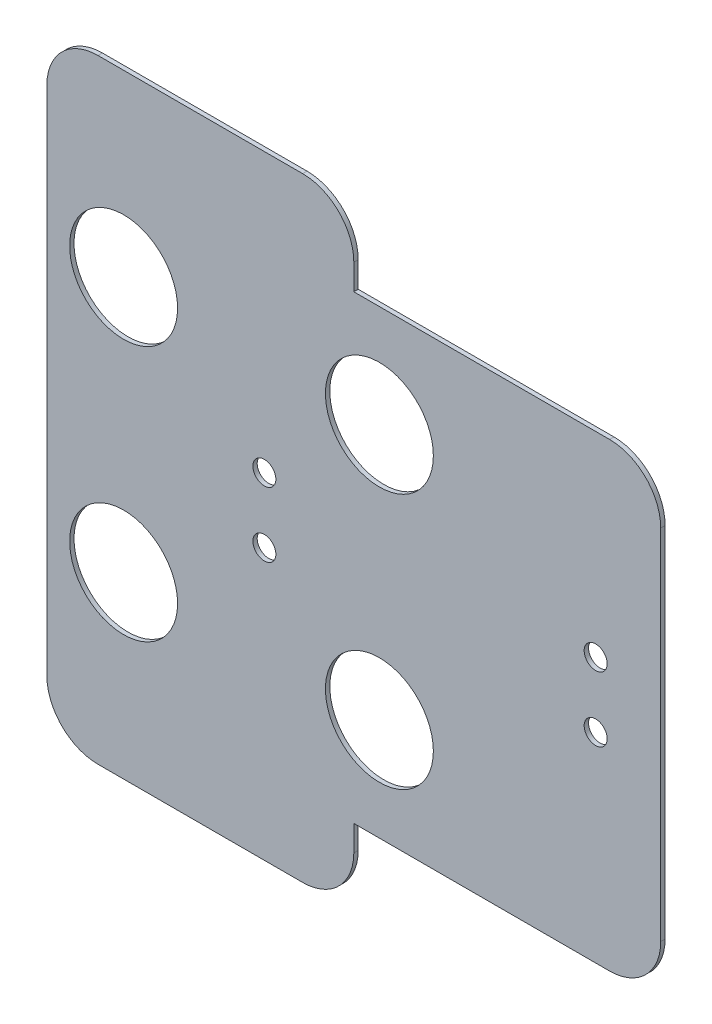
ISO-10303-21;
HEADER;
FILE_DESCRIPTION(('STEP AP214'),'2;1');
FILE_NAME('part.step','',(''),(''),'','','');
FILE_SCHEMA(('AUTOMOTIVE_DESIGN { 1 0 10303 214 1 1 1 1 }'));
ENDSEC;
DATA;
#1=APPLICATION_CONTEXT('core data for automotive mechanical design processes');
#2=APPLICATION_PROTOCOL_DEFINITION('international standard','automotive_design',2000,#1);
#3=PRODUCT_CONTEXT('',#1,'mechanical');
#4=PRODUCT('Part','Part','',(#3));
#5=PRODUCT_RELATED_PRODUCT_CATEGORY('part','',(#4));
#6=PRODUCT_DEFINITION_FORMATION('','',#4);
#7=PRODUCT_DEFINITION_CONTEXT('part definition',#1,'design');
#8=PRODUCT_DEFINITION('design','',#6,#7);
#9=PRODUCT_DEFINITION_SHAPE('','',#8);
#10=(LENGTH_UNIT() NAMED_UNIT(*) SI_UNIT(.MILLI.,.METRE.));
#11=(NAMED_UNIT(*) PLANE_ANGLE_UNIT() SI_UNIT($,.RADIAN.));
#12=(NAMED_UNIT(*) SI_UNIT($,.STERADIAN.) SOLID_ANGLE_UNIT());
#13=UNCERTAINTY_MEASURE_WITH_UNIT(LENGTH_MEASURE(1.E-05),#10,'distance_accuracy_value','');
#14=(GEOMETRIC_REPRESENTATION_CONTEXT(3) GLOBAL_UNCERTAINTY_ASSIGNED_CONTEXT((#13)) GLOBAL_UNIT_ASSIGNED_CONTEXT((#10,
#11,#12)) REPRESENTATION_CONTEXT('',''));
#15=CARTESIAN_POINT('',(0.,0.,0.));
#16=DIRECTION('',(0.,0.,1.));
#17=DIRECTION('',(1.,0.,0.));
#18=AXIS2_PLACEMENT_3D('',#15,#16,#17);
#19=CARTESIAN_POINT('',(83.471000671387,67.665000915527,-0.41148));
#20=DIRECTION('',(0.,0.,-1.));
#21=DIRECTION('',(0.,-1.,0.));
#22=AXIS2_PLACEMENT_3D('',#19,#20,#21);
#23=PLANE('',#22);
#24=CARTESIAN_POINT('',(104.927,79.019,-0.41148));
#25=DIRECTION('',(0.,0.,1.));
#26=DIRECTION('',(1.,0.,0.));
#27=AXIS2_PLACEMENT_3D('',#24,#25,#26);
#28=CIRCLE('',#27,0.45);
#29=CARTESIAN_POINT('',(105.377,79.019,-0.41148));
#30=VERTEX_POINT('',#29);
#31=EDGE_CURVE('P0_E48',#30,#30,#28,.T.);
#32=ORIENTED_EDGE('',*,*,#31,.T.);
#33=EDGE_LOOP('',(#32));
#34=FACE_BOUND('',#33,.T.);
#35=CARTESIAN_POINT('',(96.471000671387,82.665000915527,-0.41148));
#36=DIRECTION('',(0.,0.,1.));
#37=DIRECTION('',(1.,0.,0.));
#38=AXIS2_PLACEMENT_3D('',#35,#36,#37);
#39=CIRCLE('',#38,2.109999895096);
#40=CARTESIAN_POINT('',(98.581000566483,82.665000915527,-0.41148));
#41=VERTEX_POINT('',#40);
#42=EDGE_CURVE('P0_E260',#41,#41,#39,.T.);
#43=ORIENTED_EDGE('',*,*,#42,.T.);
#44=EDGE_LOOP('',(#43));
#45=FACE_BOUND('',#44,.T.);
#46=CARTESIAN_POINT('',(104.927,76.479,-0.41148));
#47=DIRECTION('',(0.,0.,1.));
#48=DIRECTION('',(1.,0.,0.));
#49=AXIS2_PLACEMENT_3D('',#46,#47,#48);
#50=CIRCLE('',#49,0.45);
#51=CARTESIAN_POINT('',(105.377,76.479,-0.41148));
#52=VERTEX_POINT('',#51);
#53=EDGE_CURVE('P0_E331',#52,#52,#50,.T.);
#54=ORIENTED_EDGE('',*,*,#53,.T.);
#55=EDGE_LOOP('',(#54));
#56=FACE_BOUND('',#55,.T.);
#57=CARTESIAN_POINT('',(96.471000671387,72.665000915527,-0.41148));
#58=DIRECTION('',(0.,0.,1.));
#59=DIRECTION('',(1.,0.,0.));
#60=AXIS2_PLACEMENT_3D('',#57,#58,#59);
#61=CIRCLE('',#60,2.109999895096);
#62=CARTESIAN_POINT('',(98.581000566483,72.665000915527,-0.41148));
#63=VERTEX_POINT('',#62);
#64=EDGE_CURVE('P0_E310',#63,#63,#61,.T.);
#65=ORIENTED_EDGE('',*,*,#64,.T.);
#66=EDGE_LOOP('',(#65));
#67=FACE_BOUND('',#66,.T.);
#68=CARTESIAN_POINT('',(91.973,78.791,-0.41148));
#69=DIRECTION('',(0.,0.,1.));
#70=DIRECTION('',(1.,0.,0.));
#71=AXIS2_PLACEMENT_3D('',#68,#69,#70);
#72=CIRCLE('',#71,0.45);
#73=CARTESIAN_POINT('',(92.423,78.791,-0.41148));
#74=VERTEX_POINT('',#73);
#75=EDGE_CURVE('P0_E311',#74,#74,#72,.T.);
#76=ORIENTED_EDGE('',*,*,#75,.T.);
#77=EDGE_LOOP('',(#76));
#78=FACE_BOUND('',#77,.T.);
#79=CARTESIAN_POINT('',(86.471000671387,82.665000915527,-0.41148));
#80=DIRECTION('',(0.,0.,1.));
#81=DIRECTION('',(1.,0.,0.));
#82=AXIS2_PLACEMENT_3D('',#79,#80,#81);
#83=CIRCLE('',#82,2.109999895096);
#84=CARTESIAN_POINT('',(88.581000566483,82.665000915527,-0.41148));
#85=VERTEX_POINT('',#84);
#86=EDGE_CURVE('P0_E301',#85,#85,#83,.T.);
#87=ORIENTED_EDGE('',*,*,#86,.T.);
#88=EDGE_LOOP('',(#87));
#89=FACE_BOUND('',#88,.T.);
#90=CARTESIAN_POINT('',(91.973,76.251,-0.41148));
#91=DIRECTION('',(0.,0.,1.));
#92=DIRECTION('',(1.,0.,0.));
#93=AXIS2_PLACEMENT_3D('',#90,#91,#92);
#94=CIRCLE('',#93,0.45);
#95=CARTESIAN_POINT('',(92.423,76.251,-0.41148));
#96=VERTEX_POINT('',#95);
#97=EDGE_CURVE('P0_E302',#96,#96,#94,.T.);
#98=ORIENTED_EDGE('',*,*,#97,.T.);
#99=EDGE_LOOP('',(#98));
#100=FACE_BOUND('',#99,.T.);
#101=CARTESIAN_POINT('',(86.471000671387,72.665000915527,-0.41148));
#102=DIRECTION('',(0.,0.,1.));
#103=DIRECTION('',(1.,0.,0.));
#104=AXIS2_PLACEMENT_3D('',#101,#102,#103);
#105=CIRCLE('',#104,2.109999895096);
#106=CARTESIAN_POINT('',(88.581000566483,72.665000915527,-0.41148));
#107=VERTEX_POINT('',#106);
#108=EDGE_CURVE('P0_E323',#107,#107,#105,.T.);
#109=ORIENTED_EDGE('',*,*,#108,.T.);
#110=EDGE_LOOP('',(#109));
#111=FACE_BOUND('',#110,.T.);
#112=DIRECTION('',(0.,-1.,0.));
#113=VECTOR('',#112,1.);
#114=CARTESIAN_POINT('',(83.471000671387,87.665000915527,-0.41148));
#115=LINE('',#114,#113);
#116=CARTESIAN_POINT('',(83.471000671387,87.665000915527,-0.41148));
#117=VERTEX_POINT('',#116);
#118=CARTESIAN_POINT('',(83.471000671387,67.665000915527,-0.41148));
#119=VERTEX_POINT('',#118);
#120=EDGE_CURVE('P0_E295',#117,#119,#115,.T.);
#121=ORIENTED_EDGE('',*,*,#120,.F.);
#122=CARTESIAN_POINT('',(85.470018929017,87.665982657897,-0.41148));
#123=DIRECTION('',(0.,0.,1.));
#124=DIRECTION('',(0.000491112198694895,0.999999879404397,0.));
#125=AXIS2_PLACEMENT_3D('',#122,#123,#124);
#126=CIRCLE('',#125,1.999018498703);
#127=CARTESIAN_POINT('',(85.471000671387,89.665000915527,-0.41148));
#128=VERTEX_POINT('',#127);
#129=EDGE_CURVE('P0_E290',#128,#117,#126,.T.);
#130=ORIENTED_EDGE('',*,*,#129,.F.);
#131=DIRECTION('',(-1.,0.,0.));
#132=VECTOR('',#131,1.);
#133=CARTESIAN_POINT('',(93.471000671387,89.665000915527,-0.41148));
#134=LINE('',#133,#132);
#135=CARTESIAN_POINT('',(93.471000671387,89.665000915527,-0.41148));
#136=VERTEX_POINT('',#135);
#137=EDGE_CURVE('P0_E303',#136,#128,#134,.T.);
#138=ORIENTED_EDGE('',*,*,#137,.F.);
#139=CARTESIAN_POINT('',(93.471982413757,87.665982657897,-0.41148));
#140=DIRECTION('',(0.,0.,1.));
#141=DIRECTION('',(0.999999879404397,-0.000491112198694895,0.));
#142=AXIS2_PLACEMENT_3D('',#139,#140,#141);
#143=CIRCLE('',#142,1.999018498703);
#144=CARTESIAN_POINT('',(95.471000671387,87.665000915527,-0.41148));
#145=VERTEX_POINT('',#144);
#146=EDGE_CURVE('P0_E326',#145,#136,#143,.T.);
#147=ORIENTED_EDGE('',*,*,#146,.F.);
#148=DIRECTION('',(0.,1.,0.));
#149=VECTOR('',#148,1.);
#150=CARTESIAN_POINT('',(95.471000671387,86.665000915527,-0.41148));
#151=LINE('',#150,#149);
#152=CARTESIAN_POINT('',(95.471000671387,86.665000915527,-0.41148));
#153=VERTEX_POINT('',#152);
#154=EDGE_CURVE('P0_E318',#153,#145,#151,.T.);
#155=ORIENTED_EDGE('',*,*,#154,.F.);
#156=DIRECTION('',(-1.,0.,0.));
#157=VECTOR('',#156,1.);
#158=CARTESIAN_POINT('',(105.47100067138,86.665000915527,-0.41148));
#159=LINE('',#158,#157);
#160=CARTESIAN_POINT('',(105.47100067138,86.665000915527,-0.41148));
#161=VERTEX_POINT('',#160);
#162=EDGE_CURVE('P0_E278',#161,#153,#159,.T.);
#163=ORIENTED_EDGE('',*,*,#162,.F.);
#164=CARTESIAN_POINT('',(105.47198241375,84.665982657897,-0.41148));
#165=DIRECTION('',(0.,0.,1.));
#166=DIRECTION('',(0.999999879404397,-0.000491112198694895,0.));
#167=AXIS2_PLACEMENT_3D('',#164,#165,#166);
#168=CIRCLE('',#167,1.999018498703);
#169=CARTESIAN_POINT('',(107.47100067138,84.665000915527,-0.41148));
#170=VERTEX_POINT('',#169);
#171=EDGE_CURVE('P0_E335',#170,#161,#168,.T.);
#172=ORIENTED_EDGE('',*,*,#171,.F.);
#173=DIRECTION('',(0.,1.,0.));
#174=VECTOR('',#173,1.);
#175=CARTESIAN_POINT('',(107.47100067138,70.665000915527,-0.41148));
#176=LINE('',#175,#174);
#177=CARTESIAN_POINT('',(107.47100067138,70.665000915527,-0.41148));
#178=VERTEX_POINT('',#177);
#179=EDGE_CURVE('P0_E315',#178,#170,#176,.T.);
#180=ORIENTED_EDGE('',*,*,#179,.F.);
#181=CARTESIAN_POINT('',(105.47027620846,70.665725378447,-0.41148));
#182=DIRECTION('',(0.,0.,1.));
#183=DIRECTION('',(0.00036210027185349,-0.999999934441694,0.));
#184=AXIS2_PLACEMENT_3D('',#181,#182,#183);
#185=CIRCLE('',#184,2.000724594084);
#186=CARTESIAN_POINT('',(105.47100067138,68.665000915527,-0.41148));
#187=VERTEX_POINT('',#186);
#188=EDGE_CURVE('P0_E276',#187,#178,#185,.T.);
#189=ORIENTED_EDGE('',*,*,#188,.F.);
#190=DIRECTION('',(1.,0.,0.));
#191=VECTOR('',#190,1.);
#192=CARTESIAN_POINT('',(95.471000671387,68.665000915527,-0.41148));
#193=LINE('',#192,#191);
#194=CARTESIAN_POINT('',(95.471000671387,68.665000915527,-0.41148));
#195=VERTEX_POINT('',#194);
#196=EDGE_CURVE('P0_E277',#195,#187,#193,.T.);
#197=ORIENTED_EDGE('',*,*,#196,.F.);
#198=DIRECTION('',(0.,1.,0.));
#199=VECTOR('',#198,1.);
#200=CARTESIAN_POINT('',(95.471000671387,67.665000915527,-0.41148));
#201=LINE('',#200,#199);
#202=CARTESIAN_POINT('',(95.471000671387,67.665000915527,-0.41148));
#203=VERTEX_POINT('',#202);
#204=EDGE_CURVE('P0_E289',#203,#195,#201,.T.);
#205=ORIENTED_EDGE('',*,*,#204,.F.);
#206=CARTESIAN_POINT('',(93.470276208467,67.665725378447,-0.41148));
#207=DIRECTION('',(0.,0.,1.));
#208=DIRECTION('',(0.00036210027185349,-0.999999934441694,0.));
#209=AXIS2_PLACEMENT_3D('',#206,#207,#208);
#210=CIRCLE('',#209,2.000724594084);
#211=CARTESIAN_POINT('',(93.471000671387,65.665000915527,-0.41148));
#212=VERTEX_POINT('',#211);
#213=EDGE_CURVE('P0_E264',#212,#203,#210,.T.);
#214=ORIENTED_EDGE('',*,*,#213,.F.);
#215=DIRECTION('',(1.,0.,0.));
#216=VECTOR('',#215,1.);
#217=CARTESIAN_POINT('',(85.471000671387,65.665000915527,-0.41148));
#218=LINE('',#217,#216);
#219=CARTESIAN_POINT('',(85.471000671387,65.665000915527,-0.41148));
#220=VERTEX_POINT('',#219);
#221=EDGE_CURVE('P0_E269',#220,#212,#218,.T.);
#222=ORIENTED_EDGE('',*,*,#221,.F.);
#223=CARTESIAN_POINT('',(85.471725134306,67.665725378447,-0.41148));
#224=DIRECTION('',(0.,0.,1.));
#225=DIRECTION('',(-0.999999934441694,-0.00036210027185349,0.));
#226=AXIS2_PLACEMENT_3D('',#223,#224,#225);
#227=CIRCLE('',#226,2.000724594084);
#228=EDGE_CURVE('P0_E259',#119,#220,#227,.T.);
#229=ORIENTED_EDGE('',*,*,#228,.F.);
#230=EDGE_LOOP('',(#121,#130,#138,#147,#155,#163,#172,#180,#189,#197,#205,#214,#222,#229));
#231=FACE_BOUND('',#230,.T.);
#232=ADVANCED_FACE('P0_F40',(#34,#45,#56,#67,#78,#89,#100,#111,#231),#23,.T.);
#233=CARTESIAN_POINT('',(104.927,79.019,-0.41148));
#234=DIRECTION('',(0.,0.,-1.));
#235=DIRECTION('',(1.,0.,0.));
#236=AXIS2_PLACEMENT_3D('',#233,#234,#235);
#237=CYLINDRICAL_SURFACE('',#236,0.45);
#238=DIRECTION('',(0.,0.,1.));
#239=VECTOR('',#238,1.);
#240=CARTESIAN_POINT('',(105.377,79.019,-0.41148));
#241=LINE('',#240,#239);
#242=CARTESIAN_POINT('',(105.377,79.019,-0.24018041730077));
#243=VERTEX_POINT('',#242);
#244=EDGE_CURVE('P0_E262',#30,#243,#241,.T.);
#245=ORIENTED_EDGE('',*,*,#244,.T.);
#246=CARTESIAN_POINT('',(104.927,79.019,-0.24018041730077));
#247=DIRECTION('',(0.,0.,-1.));
#248=DIRECTION('',(-1.,0.,0.));
#249=AXIS2_PLACEMENT_3D('',#246,#247,#248);
#250=CIRCLE('',#249,0.45);
#251=EDGE_CURVE('P0_E53',#243,#243,#250,.F.);
#252=ORIENTED_EDGE('',*,*,#251,.T.);
#253=ORIENTED_EDGE('',*,*,#244,.F.);
#254=ORIENTED_EDGE('',*,*,#31,.F.);
#255=EDGE_LOOP('',(#245,#252,#253,#254));
#256=FACE_BOUND('',#255,.T.);
#257=ADVANCED_FACE('P0_F430',(#256),#237,.F.);
#258=CARTESIAN_POINT('',(96.471000671387,82.665000915527,-0.41148));
#259=DIRECTION('',(0.,0.,-1.));
#260=DIRECTION('',(1.,0.,0.));
#261=AXIS2_PLACEMENT_3D('',#258,#259,#260);
#262=CYLINDRICAL_SURFACE('',#261,2.109999895096);
#263=DIRECTION('',(0.,0.,1.));
#264=VECTOR('',#263,1.);
#265=CARTESIAN_POINT('',(98.581000566483,82.665000915527,-0.41148));
#266=LINE('',#265,#264);
#267=CARTESIAN_POINT('',(98.581000566483,82.665000915527,-0.24018041730077));
#268=VERTEX_POINT('',#267);
#269=EDGE_CURVE('P0_E263',#41,#268,#266,.T.);
#270=ORIENTED_EDGE('',*,*,#269,.T.);
#271=CARTESIAN_POINT('',(96.471000671387,82.665000915527,-0.24018041730077));
#272=DIRECTION('',(0.,0.,-1.));
#273=DIRECTION('',(-1.,0.,0.));
#274=AXIS2_PLACEMENT_3D('',#271,#272,#273);
#275=CIRCLE('',#274,2.109999895096);
#276=EDGE_CURVE('P0_E58',#268,#268,#275,.F.);
#277=ORIENTED_EDGE('',*,*,#276,.T.);
#278=ORIENTED_EDGE('',*,*,#269,.F.);
#279=ORIENTED_EDGE('',*,*,#42,.F.);
#280=EDGE_LOOP('',(#270,#277,#278,#279));
#281=FACE_BOUND('',#280,.T.);
#282=ADVANCED_FACE('P0_F436',(#281),#262,.F.);
#283=CARTESIAN_POINT('',(104.927,76.479,-0.41148));
#284=DIRECTION('',(0.,0.,-1.));
#285=DIRECTION('',(1.,0.,0.));
#286=AXIS2_PLACEMENT_3D('',#283,#284,#285);
#287=CYLINDRICAL_SURFACE('',#286,0.45);
#288=DIRECTION('',(0.,0.,1.));
#289=VECTOR('',#288,1.);
#290=CARTESIAN_POINT('',(105.377,76.479,-0.41148));
#291=LINE('',#290,#289);
#292=CARTESIAN_POINT('',(105.377,76.479,-0.24018041730077));
#293=VERTEX_POINT('',#292);
#294=EDGE_CURVE('P0_E320',#52,#293,#291,.T.);
#295=ORIENTED_EDGE('',*,*,#294,.T.);
#296=CARTESIAN_POINT('',(104.927,76.479,-0.24018041730077));
#297=DIRECTION('',(0.,0.,-1.));
#298=DIRECTION('',(-1.,0.,0.));
#299=AXIS2_PLACEMENT_3D('',#296,#297,#298);
#300=CIRCLE('',#299,0.45);
#301=EDGE_CURVE('P0_E254',#293,#293,#300,.F.);
#302=ORIENTED_EDGE('',*,*,#301,.T.);
#303=ORIENTED_EDGE('',*,*,#294,.F.);
#304=ORIENTED_EDGE('',*,*,#53,.F.);
#305=EDGE_LOOP('',(#295,#302,#303,#304));
#306=FACE_BOUND('',#305,.T.);
#307=ADVANCED_FACE('P0_F451',(#306),#287,.F.);
#308=CARTESIAN_POINT('',(96.471000671387,72.665000915527,-0.41148));
#309=DIRECTION('',(0.,0.,-1.));
#310=DIRECTION('',(1.,0.,0.));
#311=AXIS2_PLACEMENT_3D('',#308,#309,#310);
#312=CYLINDRICAL_SURFACE('',#311,2.109999895096);
#313=DIRECTION('',(0.,0.,1.));
#314=VECTOR('',#313,1.);
#315=CARTESIAN_POINT('',(98.581000566483,72.665000915527,-0.41148));
#316=LINE('',#315,#314);
#317=CARTESIAN_POINT('',(98.581000566483,72.665000915527,-0.24018041730077));
#318=VERTEX_POINT('',#317);
#319=EDGE_CURVE('P0_E307',#63,#318,#316,.T.);
#320=ORIENTED_EDGE('',*,*,#319,.T.);
#321=CARTESIAN_POINT('',(96.471000671387,72.665000915527,-0.24018041730077));
#322=DIRECTION('',(0.,0.,-1.));
#323=DIRECTION('',(-1.,0.,0.));
#324=AXIS2_PLACEMENT_3D('',#321,#322,#323);
#325=CIRCLE('',#324,2.109999895096);
#326=EDGE_CURVE('P0_E251',#318,#318,#325,.F.);
#327=ORIENTED_EDGE('',*,*,#326,.T.);
#328=ORIENTED_EDGE('',*,*,#319,.F.);
#329=ORIENTED_EDGE('',*,*,#64,.F.);
#330=EDGE_LOOP('',(#320,#327,#328,#329));
#331=FACE_BOUND('',#330,.T.);
#332=ADVANCED_FACE('P0_F454',(#331),#312,.F.);
#333=CARTESIAN_POINT('',(91.973,78.791,-0.41148));
#334=DIRECTION('',(0.,0.,-1.));
#335=DIRECTION('',(1.,0.,0.));
#336=AXIS2_PLACEMENT_3D('',#333,#334,#335);
#337=CYLINDRICAL_SURFACE('',#336,0.45);
#338=DIRECTION('',(0.,0.,1.));
#339=VECTOR('',#338,1.);
#340=CARTESIAN_POINT('',(92.423,78.791,-0.41148));
#341=LINE('',#340,#339);
#342=CARTESIAN_POINT('',(92.423,78.791,-0.24018041730077));
#343=VERTEX_POINT('',#342);
#344=EDGE_CURVE('P0_E328',#74,#343,#341,.T.);
#345=ORIENTED_EDGE('',*,*,#344,.T.);
#346=CARTESIAN_POINT('',(91.973,78.791,-0.24018041730077));
#347=DIRECTION('',(0.,0.,-1.));
#348=DIRECTION('',(-1.,0.,0.));
#349=AXIS2_PLACEMENT_3D('',#346,#347,#348);
#350=CIRCLE('',#349,0.45);
#351=EDGE_CURVE('P0_E248',#343,#343,#350,.F.);
#352=ORIENTED_EDGE('',*,*,#351,.T.);
#353=ORIENTED_EDGE('',*,*,#344,.F.);
#354=ORIENTED_EDGE('',*,*,#75,.F.);
#355=EDGE_LOOP('',(#345,#352,#353,#354));
#356=FACE_BOUND('',#355,.T.);
#357=ADVANCED_FACE('P0_F459',(#356),#337,.F.);
#358=CARTESIAN_POINT('',(86.471000671387,82.665000915527,-0.41148));
#359=DIRECTION('',(0.,0.,-1.));
#360=DIRECTION('',(1.,0.,0.));
#361=AXIS2_PLACEMENT_3D('',#358,#359,#360);
#362=CYLINDRICAL_SURFACE('',#361,2.109999895096);
#363=DIRECTION('',(0.,0.,1.));
#364=VECTOR('',#363,1.);
#365=CARTESIAN_POINT('',(88.581000566483,82.665000915527,-0.41148));
#366=LINE('',#365,#364);
#367=CARTESIAN_POINT('',(88.581000566483,82.665000915527,-0.24018041730077));
#368=VERTEX_POINT('',#367);
#369=EDGE_CURVE('P0_E298',#85,#368,#366,.T.);
#370=ORIENTED_EDGE('',*,*,#369,.T.);
#371=CARTESIAN_POINT('',(86.471000671387,82.665000915527,-0.24018041730077));
#372=DIRECTION('',(0.,0.,-1.));
#373=DIRECTION('',(-1.,0.,0.));
#374=AXIS2_PLACEMENT_3D('',#371,#372,#373);
#375=CIRCLE('',#374,2.109999895096);
#376=EDGE_CURVE('P0_E245',#368,#368,#375,.F.);
#377=ORIENTED_EDGE('',*,*,#376,.T.);
#378=ORIENTED_EDGE('',*,*,#369,.F.);
#379=ORIENTED_EDGE('',*,*,#86,.F.);
#380=EDGE_LOOP('',(#370,#377,#378,#379));
#381=FACE_BOUND('',#380,.T.);
#382=ADVANCED_FACE('P0_F456',(#381),#362,.F.);
#383=CARTESIAN_POINT('',(91.973,76.251,-0.41148));
#384=DIRECTION('',(0.,0.,-1.));
#385=DIRECTION('',(1.,0.,0.));
#386=AXIS2_PLACEMENT_3D('',#383,#384,#385);
#387=CYLINDRICAL_SURFACE('',#386,0.45);
#388=DIRECTION('',(0.,0.,1.));
#389=VECTOR('',#388,1.);
#390=CARTESIAN_POINT('',(92.423,76.251,-0.41148));
#391=LINE('',#390,#389);
#392=CARTESIAN_POINT('',(92.423,76.251,-0.24018041730077));
#393=VERTEX_POINT('',#392);
#394=EDGE_CURVE('P0_E342',#96,#393,#391,.T.);
#395=ORIENTED_EDGE('',*,*,#394,.T.);
#396=CARTESIAN_POINT('',(91.973,76.251,-0.24018041730077));
#397=DIRECTION('',(0.,0.,-1.));
#398=DIRECTION('',(-1.,0.,0.));
#399=AXIS2_PLACEMENT_3D('',#396,#397,#398);
#400=CIRCLE('',#399,0.45);
#401=EDGE_CURVE('P0_E242',#393,#393,#400,.F.);
#402=ORIENTED_EDGE('',*,*,#401,.T.);
#403=ORIENTED_EDGE('',*,*,#394,.F.);
#404=ORIENTED_EDGE('',*,*,#97,.F.);
#405=EDGE_LOOP('',(#395,#402,#403,#404));
#406=FACE_BOUND('',#405,.T.);
#407=ADVANCED_FACE('P0_F441',(#406),#387,.F.);
#408=CARTESIAN_POINT('',(86.471000671387,72.665000915527,-0.41148));
#409=DIRECTION('',(0.,0.,-1.));
#410=DIRECTION('',(1.,0.,0.));
#411=AXIS2_PLACEMENT_3D('',#408,#409,#410);
#412=CYLINDRICAL_SURFACE('',#411,2.109999895096);
#413=DIRECTION('',(0.,0.,1.));
#414=VECTOR('',#413,1.);
#415=CARTESIAN_POINT('',(88.581000566483,72.665000915527,-0.41148));
#416=LINE('',#415,#414);
#417=CARTESIAN_POINT('',(88.581000566483,72.665000915527,-0.24018041730077));
#418=VERTEX_POINT('',#417);
#419=EDGE_CURVE('P0_E297',#107,#418,#416,.T.);
#420=ORIENTED_EDGE('',*,*,#419,.T.);
#421=CARTESIAN_POINT('',(86.471000671387,72.665000915527,-0.24018041730077));
#422=DIRECTION('',(0.,0.,-1.));
#423=DIRECTION('',(-1.,0.,0.));
#424=AXIS2_PLACEMENT_3D('',#421,#422,#423);
#425=CIRCLE('',#424,2.109999895096);
#426=EDGE_CURVE('P0_E202',#418,#418,#425,.F.);
#427=ORIENTED_EDGE('',*,*,#426,.T.);
#428=ORIENTED_EDGE('',*,*,#419,.F.);
#429=ORIENTED_EDGE('',*,*,#108,.F.);
#430=EDGE_LOOP('',(#420,#427,#428,#429));
#431=FACE_BOUND('',#430,.T.);
#432=ADVANCED_FACE('P0_F443',(#431),#412,.F.);
#433=CARTESIAN_POINT('',(83.471000671387,87.665000915527,-0.41148));
#434=DIRECTION('',(1.,0.,0.));
#435=DIRECTION('',(0.,1.,0.));
#436=AXIS2_PLACEMENT_3D('',#433,#434,#435);
#437=PLANE('',#436);
#438=DIRECTION('',(0.,0.,1.));
#439=VECTOR('',#438,1.);
#440=CARTESIAN_POINT('',(83.471000671387,67.665000915527,-0.41148));
#441=LINE('',#440,#439);
#442=CARTESIAN_POINT('',(83.471000671387,67.665000915527,-0.24018041730077));
#443=VERTEX_POINT('',#442);
#444=EDGE_CURVE('P0_E272',#119,#443,#441,.T.);
#445=ORIENTED_EDGE('',*,*,#444,.T.);
#446=DIRECTION('',(0.,-1.,0.));
#447=VECTOR('',#446,1.);
#448=CARTESIAN_POINT('',(83.471000671387,90.4654013301339,-0.24018041730077));
#449=LINE('',#448,#447);
#450=CARTESIAN_POINT('',(83.471000671387,87.665000915527,-0.24018041730077));
#451=VERTEX_POINT('',#450);
#452=EDGE_CURVE('P0_E210',#451,#443,#449,.T.);
#453=ORIENTED_EDGE('',*,*,#452,.F.);
#454=DIRECTION('',(0.,0.,1.));
#455=VECTOR('',#454,1.);
#456=CARTESIAN_POINT('',(83.471000671387,87.665000915527,-0.41148));
#457=LINE('',#456,#455);
#458=EDGE_CURVE('P0_E208',#117,#451,#457,.T.);
#459=ORIENTED_EDGE('',*,*,#458,.F.);
#460=ORIENTED_EDGE('',*,*,#120,.T.);
#461=EDGE_LOOP('',(#445,#453,#459,#460));
#462=FACE_BOUND('',#461,.T.);
#463=ADVANCED_FACE('P0_F410',(#462),#437,.F.);
#464=CARTESIAN_POINT('',(85.470018929017,87.665982657897,-0.41148));
#465=DIRECTION('',(0.,0.,-1.));
#466=DIRECTION('',(0.000491112198694895,0.999999879404397,0.));
#467=AXIS2_PLACEMENT_3D('',#464,#465,#466);
#468=CYLINDRICAL_SURFACE('',#467,1.999018498703);
#469=CARTESIAN_POINT('',(83.471000671387,87.665982657897,-0.24018041730077));
#470=VERTEX_POINT('',#469);
#471=EDGE_CURVE('P0_E195',#470,#451,#449,.T.);
#472=ORIENTED_EDGE('',*,*,#471,.F.);
#473=CARTESIAN_POINT('',(85.470018929017,87.665982657897,-0.24018041730077));
#474=DIRECTION('',(0.,0.,-1.));
#475=DIRECTION('',(-1.,0.,0.));
#476=AXIS2_PLACEMENT_3D('',#473,#474,#475);
#477=CIRCLE('',#476,1.999018498703);
#478=CARTESIAN_POINT('',(85.471000671387,89.665000915527,-0.24018041730077));
#479=VERTEX_POINT('',#478);
#480=EDGE_CURVE('P0_E191',#479,#470,#477,.F.);
#481=ORIENTED_EDGE('',*,*,#480,.F.);
#482=DIRECTION('',(0.,0.,1.));
#483=VECTOR('',#482,1.);
#484=CARTESIAN_POINT('',(85.471000671387,89.665000915527,-0.41148));
#485=LINE('',#484,#483);
#486=EDGE_CURVE('P0_E292',#128,#479,#485,.T.);
#487=ORIENTED_EDGE('',*,*,#486,.F.);
#488=ORIENTED_EDGE('',*,*,#129,.T.);
#489=ORIENTED_EDGE('',*,*,#458,.T.);
#490=EDGE_LOOP('',(#472,#481,#487,#488,#489));
#491=FACE_BOUND('',#490,.T.);
#492=ADVANCED_FACE('P0_F205',(#491),#468,.T.);
#493=CARTESIAN_POINT('',(93.471000671387,89.665000915527,-0.41148));
#494=DIRECTION('',(0.,-1.,0.));
#495=DIRECTION('',(0.,0.,-1.));
#496=AXIS2_PLACEMENT_3D('',#493,#494,#495);
#497=PLANE('',#496);
#498=ORIENTED_EDGE('',*,*,#486,.T.);
#499=DIRECTION('',(1.,0.,0.));
#500=VECTOR('',#499,1.);
#501=CARTESIAN_POINT('',(93.471000671387,89.665000915527,-0.24018041730077));
#502=LINE('',#501,#500);
#503=CARTESIAN_POINT('',(93.471000671387,89.6650009155272,-0.24018041730077));
#504=VERTEX_POINT('',#503);
#505=EDGE_CURVE('P0_E198',#479,#504,#502,.T.);
#506=ORIENTED_EDGE('',*,*,#505,.T.);
#507=DIRECTION('',(0.,0.,1.));
#508=VECTOR('',#507,1.);
#509=CARTESIAN_POINT('',(93.471000671387,89.665000915527,-0.41148));
#510=LINE('',#509,#508);
#511=EDGE_CURVE('P0_E306',#136,#504,#510,.T.);
#512=ORIENTED_EDGE('',*,*,#511,.F.);
#513=ORIENTED_EDGE('',*,*,#137,.T.);
#514=EDGE_LOOP('',(#498,#506,#512,#513));
#515=FACE_BOUND('',#514,.T.);
#516=ADVANCED_FACE('P0_F406',(#515),#497,.F.);
#517=CARTESIAN_POINT('',(93.471982413757,87.665982657897,-0.41148));
#518=DIRECTION('',(0.,0.,-1.));
#519=DIRECTION('',(0.999999879404397,-0.000491112198694895,0.));
#520=AXIS2_PLACEMENT_3D('',#517,#518,#519);
#521=CYLINDRICAL_SURFACE('',#520,1.999018498703);
#522=CARTESIAN_POINT('',(93.471982413757,87.665982657897,-0.24018041730077));
#523=DIRECTION('',(0.,0.,-1.));
#524=DIRECTION('',(-1.,0.,0.));
#525=AXIS2_PLACEMENT_3D('',#522,#523,#524);
#526=CIRCLE('',#525,1.999018498703);
#527=CARTESIAN_POINT('',(95.471000671387,87.665000915527,-0.24018041730077));
#528=VERTEX_POINT('',#527);
#529=EDGE_CURVE('P0_E237',#528,#504,#526,.F.);
#530=ORIENTED_EDGE('',*,*,#529,.F.);
#531=DIRECTION('',(0.,0.,1.));
#532=VECTOR('',#531,1.);
#533=CARTESIAN_POINT('',(95.471000671387,87.665000915527,-0.41148));
#534=LINE('',#533,#532);
#535=EDGE_CURVE('P0_E348',#145,#528,#534,.T.);
#536=ORIENTED_EDGE('',*,*,#535,.F.);
#537=ORIENTED_EDGE('',*,*,#146,.T.);
#538=ORIENTED_EDGE('',*,*,#511,.T.);
#539=EDGE_LOOP('',(#530,#536,#537,#538));
#540=FACE_BOUND('',#539,.T.);
#541=ADVANCED_FACE('P0_F403',(#540),#521,.T.);
#542=CARTESIAN_POINT('',(95.471000671387,86.665000915527,-0.41148));
#543=DIRECTION('',(-1.,0.,0.));
#544=DIRECTION('',(0.,0.,1.));
#545=AXIS2_PLACEMENT_3D('',#542,#543,#544);
#546=PLANE('',#545);
#547=ORIENTED_EDGE('',*,*,#535,.T.);
#548=DIRECTION('',(0.,-1.,0.));
#549=VECTOR('',#548,1.);
#550=CARTESIAN_POINT('',(95.471000671387,86.665000915527,-0.24018041730077));
#551=LINE('',#550,#549);
#552=CARTESIAN_POINT('',(95.471000671387,86.665000915527,-0.24018041730077));
#553=VERTEX_POINT('',#552);
#554=EDGE_CURVE('P0_E234',#528,#553,#551,.T.);
#555=ORIENTED_EDGE('',*,*,#554,.T.);
#556=DIRECTION('',(0.,0.,1.));
#557=VECTOR('',#556,1.);
#558=CARTESIAN_POINT('',(95.471000671387,86.665000915527,-0.41148));
#559=LINE('',#558,#557);
#560=EDGE_CURVE('P0_E281',#153,#553,#559,.T.);
#561=ORIENTED_EDGE('',*,*,#560,.F.);
#562=ORIENTED_EDGE('',*,*,#154,.T.);
#563=EDGE_LOOP('',(#547,#555,#561,#562));
#564=FACE_BOUND('',#563,.T.);
#565=ADVANCED_FACE('P0_F399',(#564),#546,.F.);
#566=CARTESIAN_POINT('',(105.47100067138,86.665000915527,-0.41148));
#567=DIRECTION('',(0.,-1.,0.));
#568=DIRECTION('',(0.,0.,-1.));
#569=AXIS2_PLACEMENT_3D('',#566,#567,#568);
#570=PLANE('',#569);
#571=ORIENTED_EDGE('',*,*,#560,.T.);
#572=DIRECTION('',(1.,0.,0.));
#573=VECTOR('',#572,1.);
#574=CARTESIAN_POINT('',(105.47100067138,86.665000915527,-0.24018041730077));
#575=LINE('',#574,#573);
#576=CARTESIAN_POINT('',(105.47100067138,86.6650009155272,-0.24018041730077));
#577=VERTEX_POINT('',#576);
#578=EDGE_CURVE('P0_E231',#553,#577,#575,.T.);
#579=ORIENTED_EDGE('',*,*,#578,.T.);
#580=DIRECTION('',(0.,0.,1.));
#581=VECTOR('',#580,1.);
#582=CARTESIAN_POINT('',(105.47100067138,86.665000915527,-0.41148));
#583=LINE('',#582,#581);
#584=EDGE_CURVE('P0_E282',#161,#577,#583,.T.);
#585=ORIENTED_EDGE('',*,*,#584,.F.);
#586=ORIENTED_EDGE('',*,*,#162,.T.);
#587=EDGE_LOOP('',(#571,#579,#585,#586));
#588=FACE_BOUND('',#587,.T.);
#589=ADVANCED_FACE('P0_F42',(#588),#570,.F.);
#590=CARTESIAN_POINT('',(105.47198241375,84.665982657897,-0.41148));
#591=DIRECTION('',(0.,0.,-1.));
#592=DIRECTION('',(0.999999879404397,-0.000491112198694895,0.));
#593=AXIS2_PLACEMENT_3D('',#590,#591,#592);
#594=CYLINDRICAL_SURFACE('',#593,1.999018498703);
#595=CARTESIAN_POINT('',(105.47198241375,84.665982657897,-0.24018041730077));
#596=DIRECTION('',(0.,0.,-1.));
#597=DIRECTION('',(-1.,0.,0.));
#598=AXIS2_PLACEMENT_3D('',#595,#596,#597);
#599=CIRCLE('',#598,1.999018498703);
#600=CARTESIAN_POINT('',(107.471000912453,84.665982657897,-0.24018041730077));
#601=VERTEX_POINT('',#600);
#602=EDGE_CURVE('P0_E229',#601,#577,#599,.F.);
#603=ORIENTED_EDGE('',*,*,#602,.F.);
#604=DIRECTION('',(0.,-1.,0.));
#605=VECTOR('',#604,1.);
#606=CARTESIAN_POINT('',(107.471000912453,90.4654013301339,-0.24018041730077));
#607=LINE('',#606,#605);
#608=CARTESIAN_POINT('',(107.471000912453,84.665000915527,-0.24018041730077));
#609=VERTEX_POINT('',#608);
#610=EDGE_CURVE('P0_E213',#601,#609,#607,.T.);
#611=ORIENTED_EDGE('',*,*,#610,.T.);
#612=DIRECTION('',(0.,0.,1.));
#613=VECTOR('',#612,1.);
#614=CARTESIAN_POINT('',(107.47100067138,84.665000915527,-0.41148));
#615=LINE('',#614,#613);
#616=EDGE_CURVE('P0_E332',#170,#609,#615,.T.);
#617=ORIENTED_EDGE('',*,*,#616,.F.);
#618=ORIENTED_EDGE('',*,*,#171,.T.);
#619=ORIENTED_EDGE('',*,*,#584,.T.);
#620=EDGE_LOOP('',(#603,#611,#617,#618,#619));
#621=FACE_BOUND('',#620,.T.);
#622=ADVANCED_FACE('P0_F394',(#621),#594,.T.);
#623=CARTESIAN_POINT('',(107.47100067138,70.665000915527,-0.41148));
#624=DIRECTION('',(-1.,0.,0.));
#625=DIRECTION('',(0.,0.,1.));
#626=AXIS2_PLACEMENT_3D('',#623,#624,#625);
#627=PLANE('',#626);
#628=ORIENTED_EDGE('',*,*,#616,.T.);
#629=CARTESIAN_POINT('',(107.471000912453,70.665000915527,-0.24018041730077));
#630=VERTEX_POINT('',#629);
#631=EDGE_CURVE('P0_E209',#609,#630,#607,.T.);
#632=ORIENTED_EDGE('',*,*,#631,.T.);
#633=DIRECTION('',(0.,0.,1.));
#634=VECTOR('',#633,1.);
#635=CARTESIAN_POINT('',(107.47100067138,70.665000915527,-0.41148));
#636=LINE('',#635,#634);
#637=EDGE_CURVE('P0_E312',#178,#630,#636,.T.);
#638=ORIENTED_EDGE('',*,*,#637,.F.);
#639=ORIENTED_EDGE('',*,*,#179,.T.);
#640=EDGE_LOOP('',(#628,#632,#638,#639));
#641=FACE_BOUND('',#640,.T.);
#642=ADVANCED_FACE('P0_F389',(#641),#627,.F.);
#643=CARTESIAN_POINT('',(105.47027620846,70.665725378447,-0.41148));
#644=DIRECTION('',(0.,0.,-1.));
#645=DIRECTION('',(0.00036210027185349,-0.999999934441694,0.));
#646=AXIS2_PLACEMENT_3D('',#643,#644,#645);
#647=CYLINDRICAL_SURFACE('',#646,2.000724594084);
#648=CARTESIAN_POINT('',(105.47027620846,70.665725378447,-0.24018041730077));
#649=DIRECTION('',(0.,0.,-1.));
#650=DIRECTION('',(-1.,0.,0.));
#651=AXIS2_PLACEMENT_3D('',#648,#649,#650);
#652=CIRCLE('',#651,2.000724594084);
#653=CARTESIAN_POINT('',(105.47100067138,68.665000915527,-0.24018041730077));
#654=VERTEX_POINT('',#653);
#655=EDGE_CURVE('P0_E227',#654,#630,#652,.F.);
#656=ORIENTED_EDGE('',*,*,#655,.F.);
#657=DIRECTION('',(0.,0.,1.));
#658=VECTOR('',#657,1.);
#659=CARTESIAN_POINT('',(105.47100067138,68.665000915527,-0.41148));
#660=LINE('',#659,#658);
#661=EDGE_CURVE('P0_E273',#187,#654,#660,.T.);
#662=ORIENTED_EDGE('',*,*,#661,.F.);
#663=ORIENTED_EDGE('',*,*,#188,.T.);
#664=ORIENTED_EDGE('',*,*,#637,.T.);
#665=EDGE_LOOP('',(#656,#662,#663,#664));
#666=FACE_BOUND('',#665,.T.);
#667=ADVANCED_FACE('P0_F386',(#666),#647,.T.);
#668=CARTESIAN_POINT('',(95.471000671387,68.665000915527,-0.41148));
#669=DIRECTION('',(0.,1.,0.));
#670=DIRECTION('',(1.,0.,0.));
#671=AXIS2_PLACEMENT_3D('',#668,#669,#670);
#672=PLANE('',#671);
#673=ORIENTED_EDGE('',*,*,#661,.T.);
#674=DIRECTION('',(-1.,0.,0.));
#675=VECTOR('',#674,1.);
#676=CARTESIAN_POINT('',(95.471000671387,68.665000915527,-0.24018041730077));
#677=LINE('',#676,#675);
#678=CARTESIAN_POINT('',(95.471000671387,68.665000915527,-0.24018041730077));
#679=VERTEX_POINT('',#678);
#680=EDGE_CURVE('P0_E224',#654,#679,#677,.T.);
#681=ORIENTED_EDGE('',*,*,#680,.T.);
#682=DIRECTION('',(0.,0.,1.));
#683=VECTOR('',#682,1.);
#684=CARTESIAN_POINT('',(95.471000671387,68.665000915527,-0.41148));
#685=LINE('',#684,#683);
#686=EDGE_CURVE('P0_E286',#195,#679,#685,.T.);
#687=ORIENTED_EDGE('',*,*,#686,.F.);
#688=ORIENTED_EDGE('',*,*,#196,.T.);
#689=EDGE_LOOP('',(#673,#681,#687,#688));
#690=FACE_BOUND('',#689,.T.);
#691=ADVANCED_FACE('P0_F383',(#690),#672,.F.);
#692=CARTESIAN_POINT('',(95.471000671387,67.665000915527,-0.41148));
#693=DIRECTION('',(-1.,0.,0.));
#694=DIRECTION('',(0.,0.,1.));
#695=AXIS2_PLACEMENT_3D('',#692,#693,#694);
#696=PLANE('',#695);
#697=ORIENTED_EDGE('',*,*,#686,.T.);
#698=DIRECTION('',(0.,-1.,0.));
#699=VECTOR('',#698,1.);
#700=CARTESIAN_POINT('',(95.471000671387,67.665000915527,-0.24018041730077));
#701=LINE('',#700,#699);
#702=CARTESIAN_POINT('',(95.4710006713869,67.665000915527,-0.24018041730077));
#703=VERTEX_POINT('',#702);
#704=EDGE_CURVE('P0_E221',#679,#703,#701,.T.);
#705=ORIENTED_EDGE('',*,*,#704,.T.);
#706=DIRECTION('',(0.,0.,1.));
#707=VECTOR('',#706,1.);
#708=CARTESIAN_POINT('',(95.471000671387,67.665000915527,-0.41148));
#709=LINE('',#708,#707);
#710=EDGE_CURVE('P0_E267',#203,#703,#709,.T.);
#711=ORIENTED_EDGE('',*,*,#710,.F.);
#712=ORIENTED_EDGE('',*,*,#204,.T.);
#713=EDGE_LOOP('',(#697,#705,#711,#712));
#714=FACE_BOUND('',#713,.T.);
#715=ADVANCED_FACE('P0_F377',(#714),#696,.F.);
#716=CARTESIAN_POINT('',(93.470276208467,67.665725378447,-0.41148));
#717=DIRECTION('',(0.,0.,-1.));
#718=DIRECTION('',(0.00036210027185349,-0.999999934441694,0.));
#719=AXIS2_PLACEMENT_3D('',#716,#717,#718);
#720=CYLINDRICAL_SURFACE('',#719,2.000724594084);
#721=CARTESIAN_POINT('',(93.470276208467,67.665725378447,-0.24018041730077));
#722=DIRECTION('',(0.,0.,-1.));
#723=DIRECTION('',(-1.,0.,0.));
#724=AXIS2_PLACEMENT_3D('',#721,#722,#723);
#725=CIRCLE('',#724,2.000724594084);
#726=CARTESIAN_POINT('',(93.471000671387,65.665000915527,-0.24018041730077));
#727=VERTEX_POINT('',#726);
#728=EDGE_CURVE('P0_E219',#727,#703,#725,.F.);
#729=ORIENTED_EDGE('',*,*,#728,.F.);
#730=DIRECTION('',(0.,0.,1.));
#731=VECTOR('',#730,1.);
#732=CARTESIAN_POINT('',(93.471000671387,65.665000915527,-0.41148));
#733=LINE('',#732,#731);
#734=EDGE_CURVE('P0_E268',#212,#727,#733,.T.);
#735=ORIENTED_EDGE('',*,*,#734,.F.);
#736=ORIENTED_EDGE('',*,*,#213,.T.);
#737=ORIENTED_EDGE('',*,*,#710,.T.);
#738=EDGE_LOOP('',(#729,#735,#736,#737));
#739=FACE_BOUND('',#738,.T.);
#740=ADVANCED_FACE('P0_F419',(#739),#720,.T.);
#741=CARTESIAN_POINT('',(85.471000671387,65.665000915527,-0.41148));
#742=DIRECTION('',(0.,1.,0.));
#743=DIRECTION('',(1.,0.,0.));
#744=AXIS2_PLACEMENT_3D('',#741,#742,#743);
#745=PLANE('',#744);
#746=ORIENTED_EDGE('',*,*,#734,.T.);
#747=DIRECTION('',(-1.,0.,0.));
#748=VECTOR('',#747,1.);
#749=CARTESIAN_POINT('',(85.471000671387,65.665000915527,-0.24018041730077));
#750=LINE('',#749,#748);
#751=CARTESIAN_POINT('',(85.471000671387,65.6650009155271,-0.24018041730077));
#752=VERTEX_POINT('',#751);
#753=EDGE_CURVE('P0_E216',#727,#752,#750,.T.);
#754=ORIENTED_EDGE('',*,*,#753,.T.);
#755=DIRECTION('',(0.,0.,1.));
#756=VECTOR('',#755,1.);
#757=CARTESIAN_POINT('',(85.471000671387,65.665000915527,-0.41148));
#758=LINE('',#757,#756);
#759=EDGE_CURVE('P0_E283',#220,#752,#758,.T.);
#760=ORIENTED_EDGE('',*,*,#759,.F.);
#761=ORIENTED_EDGE('',*,*,#221,.T.);
#762=EDGE_LOOP('',(#746,#754,#760,#761));
#763=FACE_BOUND('',#762,.T.);
#764=ADVANCED_FACE('P0_F416',(#763),#745,.F.);
#765=CARTESIAN_POINT('',(85.471725134306,67.665725378447,-0.41148));
#766=DIRECTION('',(0.,0.,-1.));
#767=DIRECTION('',(-0.999999934441694,-0.00036210027185349,0.));
#768=AXIS2_PLACEMENT_3D('',#765,#766,#767);
#769=CYLINDRICAL_SURFACE('',#768,2.000724594084);
#770=CARTESIAN_POINT('',(85.471725134306,67.665725378447,-0.24018041730077));
#771=DIRECTION('',(0.,0.,-1.));
#772=DIRECTION('',(-1.,0.,0.));
#773=AXIS2_PLACEMENT_3D('',#770,#771,#772);
#774=CIRCLE('',#773,2.000724594084);
#775=EDGE_CURVE('P0_E11',#443,#752,#774,.F.);
#776=ORIENTED_EDGE('',*,*,#775,.F.);
#777=ORIENTED_EDGE('',*,*,#444,.F.);
#778=ORIENTED_EDGE('',*,*,#228,.T.);
#779=ORIENTED_EDGE('',*,*,#759,.T.);
#780=EDGE_LOOP('',(#776,#777,#778,#779));
#781=FACE_BOUND('',#780,.T.);
#782=ADVANCED_FACE('P0_F413',(#781),#769,.T.);
#783=CARTESIAN_POINT('',(107.471000912453,90.4654013301339,-0.24018041730077));
#784=DIRECTION('',(0.,0.,-1.));
#785=DIRECTION('',(-1.,0.,0.));
#786=AXIS2_PLACEMENT_3D('',#783,#784,#785);
#787=PLANE('',#786);
#788=ORIENTED_EDGE('',*,*,#480,.T.);
#789=ORIENTED_EDGE('',*,*,#471,.T.);
#790=ORIENTED_EDGE('',*,*,#452,.T.);
#791=ORIENTED_EDGE('',*,*,#775,.T.);
#792=ORIENTED_EDGE('',*,*,#753,.F.);
#793=ORIENTED_EDGE('',*,*,#728,.T.);
#794=ORIENTED_EDGE('',*,*,#704,.F.);
#795=ORIENTED_EDGE('',*,*,#680,.F.);
#796=ORIENTED_EDGE('',*,*,#655,.T.);
#797=ORIENTED_EDGE('',*,*,#631,.F.);
#798=ORIENTED_EDGE('',*,*,#610,.F.);
#799=ORIENTED_EDGE('',*,*,#602,.T.);
#800=ORIENTED_EDGE('',*,*,#578,.F.);
#801=ORIENTED_EDGE('',*,*,#554,.F.);
#802=ORIENTED_EDGE('',*,*,#529,.T.);
#803=ORIENTED_EDGE('',*,*,#505,.F.);
#804=EDGE_LOOP('',(#788,#789,#790,#791,#792,#793,#794,#795,#796,#797,#798,#799,#800,#801,#802,#803));
#805=FACE_BOUND('',#804,.T.);
#806=ORIENTED_EDGE('',*,*,#426,.F.);
#807=EDGE_LOOP('',(#806));
#808=FACE_BOUND('',#807,.T.);
#809=ORIENTED_EDGE('',*,*,#401,.F.);
#810=EDGE_LOOP('',(#809));
#811=FACE_BOUND('',#810,.T.);
#812=ORIENTED_EDGE('',*,*,#376,.F.);
#813=EDGE_LOOP('',(#812));
#814=FACE_BOUND('',#813,.T.);
#815=ORIENTED_EDGE('',*,*,#351,.F.);
#816=EDGE_LOOP('',(#815));
#817=FACE_BOUND('',#816,.T.);
#818=ORIENTED_EDGE('',*,*,#326,.F.);
#819=EDGE_LOOP('',(#818));
#820=FACE_BOUND('',#819,.T.);
#821=ORIENTED_EDGE('',*,*,#301,.F.);
#822=EDGE_LOOP('',(#821));
#823=FACE_BOUND('',#822,.T.);
#824=ORIENTED_EDGE('',*,*,#276,.F.);
#825=EDGE_LOOP('',(#824));
#826=FACE_BOUND('',#825,.T.);
#827=ORIENTED_EDGE('',*,*,#251,.F.);
#828=EDGE_LOOP('',(#827));
#829=FACE_BOUND('',#828,.T.);
#830=ADVANCED_FACE('P0_F193',(#805,#808,#811,#814,#817,#820,#823,#826,#829),#787,.F.);
#831=CLOSED_SHELL('',(#232,#257,#282,#307,#332,#357,#382,#407,#432,#463,#492,#516,#541,#565,
#589,#622,#642,#667,#691,#715,#740,#764,#782,#830));
#832=MANIFOLD_SOLID_BREP('P0_B2',#831);
#833=CARTESIAN_POINT('',(86.690201965332,79.171796630859,-0.481481647012));
#834=DIRECTION('',(0.,0.,1.));
#835=DIRECTION('',(1.,0.,0.));
#836=AXIS2_PLACEMENT_3D('',#833,#834,#835);
#837=PLANE('',#836);
#838=DIRECTION('',(1.,0.,0.));
#839=VECTOR('',#838,1.);
#840=CARTESIAN_POINT('',(84.658201965332,79.171796630859,-0.481481647012));
#841=LINE('',#840,#839);
#842=CARTESIAN_POINT('',(84.658201965332,79.171796630859,-0.481481647012));
#843=VERTEX_POINT('',#842);
#844=CARTESIAN_POINT('',(86.690201965332,79.171796630859,-0.481481647012));
#845=VERTEX_POINT('',#844);
#846=EDGE_CURVE('P1_E19',#843,#845,#841,.T.);
#847=ORIENTED_EDGE('',*,*,#846,.F.);
#848=DIRECTION('',(0.,1.,0.));
#849=VECTOR('',#848,1.);
#850=CARTESIAN_POINT('',(84.658201965332,76.123796630859,-0.481481647012));
#851=LINE('',#850,#849);
#852=CARTESIAN_POINT('',(84.658201965332,76.123796630859,-0.481481647012));
#853=VERTEX_POINT('',#852);
#854=EDGE_CURVE('P1_E90',#853,#843,#851,.T.);
#855=ORIENTED_EDGE('',*,*,#854,.F.);
#856=DIRECTION('',(-1.,0.,0.));
#857=VECTOR('',#856,1.);
#858=CARTESIAN_POINT('',(86.690201965332,76.123796630859,-0.481481647012));
#859=LINE('',#858,#857);
#860=CARTESIAN_POINT('',(86.690201965332,76.123796630859,-0.481481647012));
#861=VERTEX_POINT('',#860);
#862=EDGE_CURVE('P1_E74',#861,#853,#859,.T.);
#863=ORIENTED_EDGE('',*,*,#862,.F.);
#864=DIRECTION('',(0.,-1.,0.));
#865=VECTOR('',#864,1.);
#866=CARTESIAN_POINT('',(86.690201965332,79.171796630859,-0.481481647012));
#867=LINE('',#866,#865);
#868=EDGE_CURVE('P1_E72',#845,#861,#867,.T.);
#869=ORIENTED_EDGE('',*,*,#868,.F.);
#870=EDGE_LOOP('',(#847,#855,#863,#869));
#871=FACE_BOUND('',#870,.T.);
#872=ADVANCED_FACE('P1_F16',(#871),#837,.T.);
#873=CARTESIAN_POINT('',(86.690201965332,79.171796630859,-1.711479187012));
#874=DIRECTION('',(0.,0.,1.));
#875=DIRECTION('',(1.,0.,0.));
#876=AXIS2_PLACEMENT_3D('',#873,#874,#875);
#877=PLANE('',#876);
#878=DIRECTION('',(0.,-1.,0.));
#879=VECTOR('',#878,1.);
#880=CARTESIAN_POINT('',(86.690201965332,79.171796630859,-1.711479187012));
#881=LINE('',#880,#879);
#882=CARTESIAN_POINT('',(86.690201965332,79.171796630859,-1.711479187012));
#883=VERTEX_POINT('',#882);
#884=CARTESIAN_POINT('',(86.690201965332,76.123796630859,-1.711479187012));
#885=VERTEX_POINT('',#884);
#886=EDGE_CURVE('P1_E84',#883,#885,#881,.T.);
#887=ORIENTED_EDGE('',*,*,#886,.T.);
#888=DIRECTION('',(-1.,0.,0.));
#889=VECTOR('',#888,1.);
#890=CARTESIAN_POINT('',(86.690201965332,76.123796630859,-1.711479187012));
#891=LINE('',#890,#889);
#892=CARTESIAN_POINT('',(84.658201965332,76.123796630859,-1.711479187012));
#893=VERTEX_POINT('',#892);
#894=EDGE_CURVE('P1_E92',#885,#893,#891,.T.);
#895=ORIENTED_EDGE('',*,*,#894,.T.);
#896=DIRECTION('',(0.,1.,0.));
#897=VECTOR('',#896,1.);
#898=CARTESIAN_POINT('',(84.658201965332,76.123796630859,-1.711479187012));
#899=LINE('',#898,#897);
#900=CARTESIAN_POINT('',(84.658201965332,79.171796630859,-1.711479187012));
#901=VERTEX_POINT('',#900);
#902=EDGE_CURVE('P1_E70',#893,#901,#899,.T.);
#903=ORIENTED_EDGE('',*,*,#902,.T.);
#904=DIRECTION('',(1.,0.,0.));
#905=VECTOR('',#904,1.);
#906=CARTESIAN_POINT('',(84.658201965332,79.171796630859,-1.711479187012));
#907=LINE('',#906,#905);
#908=EDGE_CURVE('P1_E11',#901,#883,#907,.T.);
#909=ORIENTED_EDGE('',*,*,#908,.T.);
#910=EDGE_LOOP('',(#887,#895,#903,#909));
#911=FACE_BOUND('',#910,.T.);
#912=ADVANCED_FACE('P1_F112',(#911),#877,.F.);
#913=CARTESIAN_POINT('',(84.658201965332,79.171796630859,-1.711479187012));
#914=DIRECTION('',(0.,1.,0.));
#915=DIRECTION('',(1.,0.,0.));
#916=AXIS2_PLACEMENT_3D('',#913,#914,#915);
#917=PLANE('',#916);
#918=DIRECTION('',(0.,0.,1.));
#919=VECTOR('',#918,1.);
#920=CARTESIAN_POINT('',(84.658201965332,79.171796630859,-1.711479187012));
#921=LINE('',#920,#919);
#922=EDGE_CURVE('P1_E66',#901,#843,#921,.T.);
#923=ORIENTED_EDGE('',*,*,#922,.T.);
#924=ORIENTED_EDGE('',*,*,#846,.T.);
#925=DIRECTION('',(0.,0.,1.));
#926=VECTOR('',#925,1.);
#927=CARTESIAN_POINT('',(86.690201965332,79.171796630859,-1.711479187012));
#928=LINE('',#927,#926);
#929=EDGE_CURVE('P1_E64',#883,#845,#928,.T.);
#930=ORIENTED_EDGE('',*,*,#929,.F.);
#931=ORIENTED_EDGE('',*,*,#908,.F.);
#932=EDGE_LOOP('',(#923,#924,#930,#931));
#933=FACE_BOUND('',#932,.T.);
#934=ADVANCED_FACE('P1_F62',(#933),#917,.T.);
#935=CARTESIAN_POINT('',(84.658201965332,76.123796630859,-1.711479187012));
#936=DIRECTION('',(-1.,0.,0.));
#937=DIRECTION('',(0.,0.,1.));
#938=AXIS2_PLACEMENT_3D('',#935,#936,#937);
#939=PLANE('',#938);
#940=DIRECTION('',(0.,0.,1.));
#941=VECTOR('',#940,1.);
#942=CARTESIAN_POINT('',(84.658201965332,76.123796630859,-1.711479187012));
#943=LINE('',#942,#941);
#944=EDGE_CURVE('P1_E93',#893,#853,#943,.T.);
#945=ORIENTED_EDGE('',*,*,#944,.T.);
#946=ORIENTED_EDGE('',*,*,#854,.T.);
#947=ORIENTED_EDGE('',*,*,#922,.F.);
#948=ORIENTED_EDGE('',*,*,#902,.F.);
#949=EDGE_LOOP('',(#945,#946,#947,#948));
#950=FACE_BOUND('',#949,.T.);
#951=ADVANCED_FACE('P1_F116',(#950),#939,.T.);
#952=CARTESIAN_POINT('',(86.690201965332,76.123796630859,-1.711479187012));
#953=DIRECTION('',(0.,-1.,0.));
#954=DIRECTION('',(0.,0.,-1.));
#955=AXIS2_PLACEMENT_3D('',#952,#953,#954);
#956=PLANE('',#955);
#957=DIRECTION('',(0.,0.,1.));
#958=VECTOR('',#957,1.);
#959=CARTESIAN_POINT('',(86.690201965332,76.123796630859,-1.711479187012));
#960=LINE('',#959,#958);
#961=EDGE_CURVE('P1_E79',#885,#861,#960,.T.);
#962=ORIENTED_EDGE('',*,*,#961,.T.);
#963=ORIENTED_EDGE('',*,*,#862,.T.);
#964=ORIENTED_EDGE('',*,*,#944,.F.);
#965=ORIENTED_EDGE('',*,*,#894,.F.);
#966=EDGE_LOOP('',(#962,#963,#964,#965));
#967=FACE_BOUND('',#966,.T.);
#968=ADVANCED_FACE('P1_F114',(#967),#956,.T.);
#969=CARTESIAN_POINT('',(86.690201965332,79.171796630859,-1.711479187012));
#970=DIRECTION('',(1.,0.,0.));
#971=DIRECTION('',(0.,1.,0.));
#972=AXIS2_PLACEMENT_3D('',#969,#970,#971);
#973=PLANE('',#972);
#974=ORIENTED_EDGE('',*,*,#929,.T.);
#975=ORIENTED_EDGE('',*,*,#868,.T.);
#976=ORIENTED_EDGE('',*,*,#961,.F.);
#977=ORIENTED_EDGE('',*,*,#886,.F.);
#978=EDGE_LOOP('',(#974,#975,#976,#977));
#979=FACE_BOUND('',#978,.T.);
#980=ADVANCED_FACE('P1_F82',(#979),#973,.T.);
#981=CLOSED_SHELL('',(#872,#912,#934,#951,#968,#980));
#982=MANIFOLD_SOLID_BREP('P1_B1',#981);
#983=ADVANCED_BREP_SHAPE_REPRESENTATION('',(#18,#832,#982),#14);
#984=SHAPE_DEFINITION_REPRESENTATION(#9,#983);
ENDSEC;
END-ISO-10303-21;
